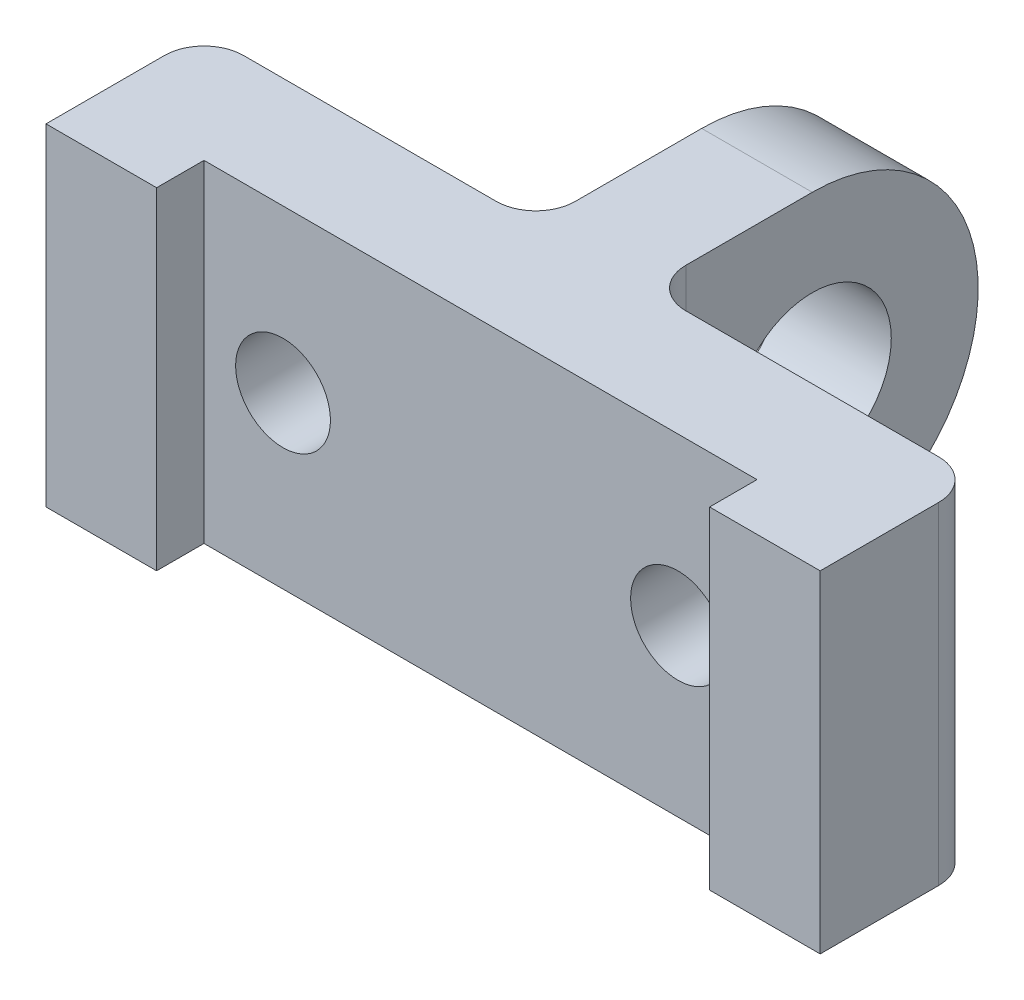
ISO-10303-21;
HEADER;
FILE_DESCRIPTION(('STEP AP214'),'2;1');
FILE_NAME('part.step','',(''),(''),'','','');
FILE_SCHEMA(('AUTOMOTIVE_DESIGN { 1 0 10303 214 1 1 1 1 }'));
ENDSEC;
DATA;
#1=APPLICATION_CONTEXT('core data for automotive mechanical design processes');
#2=APPLICATION_PROTOCOL_DEFINITION('international standard','automotive_design',2000,#1);
#3=PRODUCT_CONTEXT('',#1,'mechanical');
#4=PRODUCT('Part','Part','',(#3));
#5=PRODUCT_RELATED_PRODUCT_CATEGORY('part','',(#4));
#6=PRODUCT_DEFINITION_FORMATION('','',#4);
#7=PRODUCT_DEFINITION_CONTEXT('part definition',#1,'design');
#8=PRODUCT_DEFINITION('design','',#6,#7);
#9=PRODUCT_DEFINITION_SHAPE('','',#8);
#10=(LENGTH_UNIT() NAMED_UNIT(*) SI_UNIT(.MILLI.,.METRE.));
#11=(NAMED_UNIT(*) PLANE_ANGLE_UNIT() SI_UNIT($,.RADIAN.));
#12=(NAMED_UNIT(*) SI_UNIT($,.STERADIAN.) SOLID_ANGLE_UNIT());
#13=UNCERTAINTY_MEASURE_WITH_UNIT(LENGTH_MEASURE(1.E-05),#10,'distance_accuracy_value','');
#14=(GEOMETRIC_REPRESENTATION_CONTEXT(3) GLOBAL_UNCERTAINTY_ASSIGNED_CONTEXT((#13)) GLOBAL_UNIT_ASSIGNED_CONTEXT((#10,
#11,#12)) REPRESENTATION_CONTEXT('',''));
#15=CARTESIAN_POINT('',(0.,0.,0.));
#16=DIRECTION('',(0.,0.,1.));
#17=DIRECTION('',(1.,0.,0.));
#18=AXIS2_PLACEMENT_3D('',#15,#16,#17);
#19=CARTESIAN_POINT('',(7.,0.,-21.));
#20=DIRECTION('',(-1.,0.,0.));
#21=DIRECTION('',(0.,0.,1.));
#22=AXIS2_PLACEMENT_3D('',#19,#20,#21);
#23=CYLINDRICAL_SURFACE('',#22,21.);
#24=DIRECTION('',(-1.,0.,0.));
#25=VECTOR('',#24,1.);
#26=CARTESIAN_POINT('',(-49.,21.,-21.));
#27=LINE('',#26,#25);
#28=CARTESIAN_POINT('',(7.,21.,-21.));
#29=VERTEX_POINT('',#28);
#30=CARTESIAN_POINT('',(-7.,21.,-21.));
#31=VERTEX_POINT('',#30);
#32=EDGE_CURVE('E261',#29,#31,#27,.T.);
#33=ORIENTED_EDGE('',*,*,#32,.F.);
#34=CARTESIAN_POINT('',(7.,0.,-21.));
#35=DIRECTION('',(1.,0.,0.));
#36=DIRECTION('',(0.,0.,-1.));
#37=AXIS2_PLACEMENT_3D('',#34,#35,#36);
#38=CIRCLE('',#37,21.);
#39=CARTESIAN_POINT('',(7.,-21.,-21.));
#40=VERTEX_POINT('',#39);
#41=EDGE_CURVE('E267',#40,#29,#38,.T.);
#42=ORIENTED_EDGE('',*,*,#41,.F.);
#43=DIRECTION('',(-1.,0.,0.));
#44=VECTOR('',#43,1.);
#45=CARTESIAN_POINT('',(-49.,-21.,-21.));
#46=LINE('',#45,#44);
#47=CARTESIAN_POINT('',(-7.,-21.,-21.));
#48=VERTEX_POINT('',#47);
#49=EDGE_CURVE('E264',#48,#40,#46,.F.);
#50=ORIENTED_EDGE('',*,*,#49,.F.);
#51=CARTESIAN_POINT('',(-7.,0.,-21.));
#52=DIRECTION('',(1.,0.,0.));
#53=DIRECTION('',(0.,0.,-1.));
#54=AXIS2_PLACEMENT_3D('',#51,#52,#53);
#55=CIRCLE('',#54,21.);
#56=EDGE_CURVE('E269',#31,#48,#55,.F.);
#57=ORIENTED_EDGE('',*,*,#56,.F.);
#58=EDGE_LOOP('',(#33,#42,#50,#57));
#59=FACE_BOUND('',#58,.T.);
#60=ADVANCED_FACE('F40',(#59),#23,.T.);
#61=CARTESIAN_POINT('',(0.,0.,0.));
#62=DIRECTION('',(0.,0.,-1.));
#63=DIRECTION('',(-1.,0.,0.));
#64=AXIS2_PLACEMENT_3D('',#61,#62,#63);
#65=PLANE('',#64);
#66=CARTESIAN_POINT('',(-25.,0.498932179860301,0.));
#67=DIRECTION('',(0.,0.,1.));
#68=DIRECTION('',(1.,0.,0.));
#69=AXIS2_PLACEMENT_3D('',#66,#67,#68);
#70=CIRCLE('',#69,6.);
#71=CARTESIAN_POINT('',(-19.,0.498932179860301,0.));
#72=VERTEX_POINT('',#71);
#73=EDGE_CURVE('E214',#72,#72,#70,.T.);
#74=ORIENTED_EDGE('',*,*,#73,.T.);
#75=EDGE_LOOP('',(#74));
#76=FACE_BOUND('',#75,.T.);
#77=DIRECTION('',(-1.,0.,0.));
#78=VECTOR('',#77,1.);
#79=CARTESIAN_POINT('',(-49.,21.,0.));
#80=LINE('',#79,#78);
#81=CARTESIAN_POINT('',(-12.,21.,0.));
#82=VERTEX_POINT('',#81);
#83=CARTESIAN_POINT('',(-44.,21.,0.));
#84=VERTEX_POINT('',#83);
#85=EDGE_CURVE('E226',#82,#84,#80,.T.);
#86=ORIENTED_EDGE('',*,*,#85,.F.);
#87=DIRECTION('',(0.,-1.,0.));
#88=VECTOR('',#87,1.);
#89=CARTESIAN_POINT('',(-12.,0.,0.));
#90=LINE('',#89,#88);
#91=CARTESIAN_POINT('',(-12.,-21.,0.));
#92=VERTEX_POINT('',#91);
#93=EDGE_CURVE('E281',#82,#92,#90,.T.);
#94=ORIENTED_EDGE('',*,*,#93,.T.);
#95=DIRECTION('',(1.,0.,0.));
#96=VECTOR('',#95,1.);
#97=CARTESIAN_POINT('',(-49.,-21.,0.));
#98=LINE('',#97,#96);
#99=CARTESIAN_POINT('',(-44.,-21.,0.));
#100=VERTEX_POINT('',#99);
#101=EDGE_CURVE('E230',#100,#92,#98,.T.);
#102=ORIENTED_EDGE('',*,*,#101,.F.);
#103=DIRECTION('',(0.,-1.,0.));
#104=VECTOR('',#103,1.);
#105=CARTESIAN_POINT('',(-44.,21.,0.));
#106=LINE('',#105,#104);
#107=EDGE_CURVE('E248',#100,#84,#106,.F.);
#108=ORIENTED_EDGE('',*,*,#107,.T.);
#109=EDGE_LOOP('',(#86,#94,#102,#108));
#110=FACE_BOUND('',#109,.T.);
#111=ADVANCED_FACE('F337',(#76,#110),#65,.T.);
#112=CARTESIAN_POINT('',(0.,0.,14.));
#113=DIRECTION('',(0.,0.,-1.));
#114=DIRECTION('',(-1.,0.,0.));
#115=AXIS2_PLACEMENT_3D('',#112,#113,#114);
#116=PLANE('',#115);
#117=CARTESIAN_POINT('',(25.,0.,14.));
#118=DIRECTION('',(0.,0.,-1.));
#119=DIRECTION('',(-1.,0.,0.));
#120=AXIS2_PLACEMENT_3D('',#117,#118,#119);
#121=CIRCLE('',#120,5.99999999999999);
#122=CARTESIAN_POINT('',(19.,0.,14.));
#123=VERTEX_POINT('',#122);
#124=EDGE_CURVE('E223',#123,#123,#121,.F.);
#125=ORIENTED_EDGE('',*,*,#124,.F.);
#126=EDGE_LOOP('',(#125));
#127=FACE_BOUND('',#126,.T.);
#128=CARTESIAN_POINT('',(-25.,0.498932179860301,14.));
#129=DIRECTION('',(0.,0.,-1.));
#130=DIRECTION('',(-1.,0.,0.));
#131=AXIS2_PLACEMENT_3D('',#128,#129,#130);
#132=CIRCLE('',#131,6.);
#133=CARTESIAN_POINT('',(-31.,0.498932179860301,14.));
#134=VERTEX_POINT('',#133);
#135=EDGE_CURVE('E217',#134,#134,#132,.F.);
#136=ORIENTED_EDGE('',*,*,#135,.F.);
#137=EDGE_LOOP('',(#136));
#138=FACE_BOUND('',#137,.T.);
#139=DIRECTION('',(0.,-1.,0.));
#140=VECTOR('',#139,1.);
#141=CARTESIAN_POINT('',(35.,-21.,14.));
#142=LINE('',#141,#140);
#143=CARTESIAN_POINT('',(35.,21.,14.));
#144=VERTEX_POINT('',#143);
#145=CARTESIAN_POINT('',(35.,-21.,14.));
#146=VERTEX_POINT('',#145);
#147=EDGE_CURVE('E180',#144,#146,#142,.T.);
#148=ORIENTED_EDGE('',*,*,#147,.F.);
#149=DIRECTION('',(-1.,0.,0.));
#150=VECTOR('',#149,1.);
#151=CARTESIAN_POINT('',(-49.,21.,14.));
#152=LINE('',#151,#150);
#153=CARTESIAN_POINT('',(-35.,21.,14.));
#154=VERTEX_POINT('',#153);
#155=EDGE_CURVE('E227',#144,#154,#152,.T.);
#156=ORIENTED_EDGE('',*,*,#155,.T.);
#157=DIRECTION('',(0.,1.,0.));
#158=VECTOR('',#157,1.);
#159=CARTESIAN_POINT('',(-35.,-21.,14.));
#160=LINE('',#159,#158);
#161=CARTESIAN_POINT('',(-35.,-21.,14.));
#162=VERTEX_POINT('',#161);
#163=EDGE_CURVE('E195',#162,#154,#160,.T.);
#164=ORIENTED_EDGE('',*,*,#163,.F.);
#165=DIRECTION('',(1.,0.,0.));
#166=VECTOR('',#165,1.);
#167=CARTESIAN_POINT('',(-49.,-21.,14.));
#168=LINE('',#167,#166);
#169=EDGE_CURVE('E229',#162,#146,#168,.T.);
#170=ORIENTED_EDGE('',*,*,#169,.T.);
#171=EDGE_LOOP('',(#148,#156,#164,#170));
#172=FACE_BOUND('',#171,.T.);
#173=ADVANCED_FACE('F317',(#127,#138,#172),#116,.F.);
#174=CARTESIAN_POINT('',(12.,-21.,0.));
#175=VERTEX_POINT('',#174);
#176=CARTESIAN_POINT('',(44.,-21.,0.));
#177=VERTEX_POINT('',#176);
#178=EDGE_CURVE('E236',#175,#177,#98,.T.);
#179=ORIENTED_EDGE('',*,*,#178,.F.);
#180=DIRECTION('',(0.,-1.,0.));
#181=VECTOR('',#180,1.);
#182=CARTESIAN_POINT('',(12.,21.,0.));
#183=LINE('',#182,#181);
#184=CARTESIAN_POINT('',(12.,21.,0.));
#185=VERTEX_POINT('',#184);
#186=EDGE_CURVE('E279',#175,#185,#183,.F.);
#187=ORIENTED_EDGE('',*,*,#186,.T.);
#188=CARTESIAN_POINT('',(44.,21.,0.));
#189=VERTEX_POINT('',#188);
#190=EDGE_CURVE('E233',#189,#185,#80,.T.);
#191=ORIENTED_EDGE('',*,*,#190,.F.);
#192=DIRECTION('',(0.,1.,0.));
#193=VECTOR('',#192,1.);
#194=CARTESIAN_POINT('',(44.,-21.,0.));
#195=LINE('',#194,#193);
#196=EDGE_CURVE('E256',#189,#177,#195,.F.);
#197=ORIENTED_EDGE('',*,*,#196,.T.);
#198=EDGE_LOOP('',(#179,#187,#191,#197));
#199=FACE_BOUND('',#198,.T.);
#200=CARTESIAN_POINT('',(25.,0.,0.));
#201=DIRECTION('',(0.,0.,1.));
#202=DIRECTION('',(1.,0.,0.));
#203=AXIS2_PLACEMENT_3D('',#200,#201,#202);
#204=CIRCLE('',#203,5.99999999999999);
#205=CARTESIAN_POINT('',(31.,0.,0.));
#206=VERTEX_POINT('',#205);
#207=EDGE_CURVE('E220',#206,#206,#204,.T.);
#208=ORIENTED_EDGE('',*,*,#207,.T.);
#209=EDGE_LOOP('',(#208));
#210=FACE_BOUND('',#209,.T.);
#211=ADVANCED_FACE('F305',(#199,#210),#65,.T.);
#212=CARTESIAN_POINT('',(49.,-21.,14.));
#213=DIRECTION('',(-1.,0.,0.));
#214=DIRECTION('',(0.,0.,1.));
#215=AXIS2_PLACEMENT_3D('',#212,#213,#214);
#216=PLANE('',#215);
#217=DIRECTION('',(0.,0.,-1.));
#218=VECTOR('',#217,1.);
#219=CARTESIAN_POINT('',(49.,-21.,14.));
#220=LINE('',#219,#218);
#221=CARTESIAN_POINT('',(49.,-21.,20.));
#222=VERTEX_POINT('',#221);
#223=CARTESIAN_POINT('',(49.,-21.,5.));
#224=VERTEX_POINT('',#223);
#225=EDGE_CURVE('E232',#222,#224,#220,.T.);
#226=ORIENTED_EDGE('',*,*,#225,.T.);
#227=DIRECTION('',(0.,1.,0.));
#228=VECTOR('',#227,1.);
#229=CARTESIAN_POINT('',(49.,21.,5.));
#230=LINE('',#229,#228);
#231=CARTESIAN_POINT('',(49.,21.,5.));
#232=VERTEX_POINT('',#231);
#233=EDGE_CURVE('E160',#224,#232,#230,.T.);
#234=ORIENTED_EDGE('',*,*,#233,.T.);
#235=DIRECTION('',(0.,0.,-1.));
#236=VECTOR('',#235,1.);
#237=CARTESIAN_POINT('',(49.,21.,14.));
#238=LINE('',#237,#236);
#239=CARTESIAN_POINT('',(49.,21.,20.));
#240=VERTEX_POINT('',#239);
#241=EDGE_CURVE('E153',#240,#232,#238,.T.);
#242=ORIENTED_EDGE('',*,*,#241,.F.);
#243=DIRECTION('',(0.,1.,0.));
#244=VECTOR('',#243,1.);
#245=CARTESIAN_POINT('',(49.,-21.,20.));
#246=LINE('',#245,#244);
#247=EDGE_CURVE('E158',#222,#240,#246,.T.);
#248=ORIENTED_EDGE('',*,*,#247,.F.);
#249=EDGE_LOOP('',(#226,#234,#242,#248));
#250=FACE_BOUND('',#249,.T.);
#251=ADVANCED_FACE('F156',(#250),#216,.F.);
#252=CARTESIAN_POINT('',(-49.,21.,14.));
#253=DIRECTION('',(0.,-1.,0.));
#254=DIRECTION('',(0.,0.,-1.));
#255=AXIS2_PLACEMENT_3D('',#252,#253,#254);
#256=PLANE('',#255);
#257=DIRECTION('',(0.,0.,1.));
#258=VECTOR('',#257,1.);
#259=CARTESIAN_POINT('',(7.,21.,0.));
#260=LINE('',#259,#258);
#261=CARTESIAN_POINT('',(7.,21.,-5.));
#262=VERTEX_POINT('',#261);
#263=EDGE_CURVE('E183',#29,#262,#260,.T.);
#264=ORIENTED_EDGE('',*,*,#263,.F.);
#265=ORIENTED_EDGE('',*,*,#32,.T.);
#266=DIRECTION('',(0.,0.,1.));
#267=VECTOR('',#266,1.);
#268=CARTESIAN_POINT('',(-7.,21.,0.));
#269=LINE('',#268,#267);
#270=CARTESIAN_POINT('',(-7.,21.,-5.));
#271=VERTEX_POINT('',#270);
#272=EDGE_CURVE('E186',#31,#271,#269,.T.);
#273=ORIENTED_EDGE('',*,*,#272,.T.);
#274=CARTESIAN_POINT('',(-12.,21.,-5.));
#275=DIRECTION('',(0.,-1.,0.));
#276=DIRECTION('',(0.,0.,-1.));
#277=AXIS2_PLACEMENT_3D('',#274,#275,#276);
#278=CIRCLE('',#277,5.);
#279=EDGE_CURVE('E11',#271,#82,#278,.T.);
#280=ORIENTED_EDGE('',*,*,#279,.T.);
#281=ORIENTED_EDGE('',*,*,#85,.T.);
#282=CARTESIAN_POINT('',(-44.,21.,5.));
#283=DIRECTION('',(0.,-1.,0.));
#284=DIRECTION('',(0.,0.,-1.));
#285=AXIS2_PLACEMENT_3D('',#282,#283,#284);
#286=CIRCLE('',#285,5.);
#287=CARTESIAN_POINT('',(-49.,21.,5.));
#288=VERTEX_POINT('',#287);
#289=EDGE_CURVE('E251',#84,#288,#286,.F.);
#290=ORIENTED_EDGE('',*,*,#289,.T.);
#291=DIRECTION('',(0.,0.,-1.));
#292=VECTOR('',#291,1.);
#293=CARTESIAN_POINT('',(-49.,21.,14.));
#294=LINE('',#293,#292);
#295=CARTESIAN_POINT('',(-49.,21.,20.));
#296=VERTEX_POINT('',#295);
#297=EDGE_CURVE('E163',#296,#288,#294,.T.);
#298=ORIENTED_EDGE('',*,*,#297,.F.);
#299=DIRECTION('',(-1.,0.,0.));
#300=VECTOR('',#299,1.);
#301=CARTESIAN_POINT('',(-49.,21.,20.));
#302=LINE('',#301,#300);
#303=CARTESIAN_POINT('',(-35.,21.,20.));
#304=VERTEX_POINT('',#303);
#305=EDGE_CURVE('E203',#304,#296,#302,.T.);
#306=ORIENTED_EDGE('',*,*,#305,.F.);
#307=DIRECTION('',(0.,0.,-1.));
#308=VECTOR('',#307,1.);
#309=CARTESIAN_POINT('',(-35.,21.,20.));
#310=LINE('',#309,#308);
#311=EDGE_CURVE('E206',#304,#154,#310,.T.);
#312=ORIENTED_EDGE('',*,*,#311,.T.);
#313=ORIENTED_EDGE('',*,*,#155,.F.);
#314=DIRECTION('',(0.,0.,-1.));
#315=VECTOR('',#314,1.);
#316=CARTESIAN_POINT('',(35.,21.,20.));
#317=LINE('',#316,#315);
#318=CARTESIAN_POINT('',(35.,21.,20.));
#319=VERTEX_POINT('',#318);
#320=EDGE_CURVE('E171',#319,#144,#317,.T.);
#321=ORIENTED_EDGE('',*,*,#320,.F.);
#322=DIRECTION('',(-1.,0.,0.));
#323=VECTOR('',#322,1.);
#324=CARTESIAN_POINT('',(49.,21.,20.));
#325=LINE('',#324,#323);
#326=EDGE_CURVE('E166',#240,#319,#325,.T.);
#327=ORIENTED_EDGE('',*,*,#326,.F.);
#328=ORIENTED_EDGE('',*,*,#241,.T.);
#329=CARTESIAN_POINT('',(44.,21.,5.));
#330=DIRECTION('',(0.,-1.,0.));
#331=DIRECTION('',(0.,0.,-1.));
#332=AXIS2_PLACEMENT_3D('',#329,#330,#331);
#333=CIRCLE('',#332,5.);
#334=EDGE_CURVE('E254',#232,#189,#333,.F.);
#335=ORIENTED_EDGE('',*,*,#334,.T.);
#336=ORIENTED_EDGE('',*,*,#190,.T.);
#337=CARTESIAN_POINT('',(12.,21.,-5.));
#338=DIRECTION('',(0.,-1.,0.));
#339=DIRECTION('',(0.,0.,-1.));
#340=AXIS2_PLACEMENT_3D('',#337,#338,#339);
#341=CIRCLE('',#340,5.);
#342=EDGE_CURVE('E287',#185,#262,#341,.T.);
#343=ORIENTED_EDGE('',*,*,#342,.T.);
#344=EDGE_LOOP('',(#264,#265,#273,#280,#281,#290,#298,#306,#312,#313,#321,#327,#328,#335,#336,#343));
#345=FACE_BOUND('',#344,.T.);
#346=ADVANCED_FACE('F168',(#345),#256,.F.);
#347=CARTESIAN_POINT('',(-49.,-21.,14.));
#348=DIRECTION('',(1.,0.,0.));
#349=DIRECTION('',(0.,0.,-1.));
#350=AXIS2_PLACEMENT_3D('',#347,#348,#349);
#351=PLANE('',#350);
#352=ORIENTED_EDGE('',*,*,#297,.T.);
#353=DIRECTION('',(0.,-1.,0.));
#354=VECTOR('',#353,1.);
#355=CARTESIAN_POINT('',(-49.,-21.,5.));
#356=LINE('',#355,#354);
#357=CARTESIAN_POINT('',(-49.,-21.,5.));
#358=VERTEX_POINT('',#357);
#359=EDGE_CURVE('E162',#288,#358,#356,.T.);
#360=ORIENTED_EDGE('',*,*,#359,.T.);
#361=DIRECTION('',(0.,0.,-1.));
#362=VECTOR('',#361,1.);
#363=CARTESIAN_POINT('',(-49.,-21.,14.));
#364=LINE('',#363,#362);
#365=CARTESIAN_POINT('',(-49.,-21.,20.));
#366=VERTEX_POINT('',#365);
#367=EDGE_CURVE('E239',#366,#358,#364,.T.);
#368=ORIENTED_EDGE('',*,*,#367,.F.);
#369=DIRECTION('',(0.,-1.,0.));
#370=VECTOR('',#369,1.);
#371=CARTESIAN_POINT('',(-49.,-21.,20.));
#372=LINE('',#371,#370);
#373=EDGE_CURVE('E196',#296,#366,#372,.T.);
#374=ORIENTED_EDGE('',*,*,#373,.F.);
#375=EDGE_LOOP('',(#352,#360,#368,#374));
#376=FACE_BOUND('',#375,.T.);
#377=ADVANCED_FACE('F328',(#376),#351,.F.);
#378=CARTESIAN_POINT('',(-49.,-21.,14.));
#379=DIRECTION('',(0.,1.,0.));
#380=DIRECTION('',(0.,0.,1.));
#381=AXIS2_PLACEMENT_3D('',#378,#379,#380);
#382=PLANE('',#381);
#383=ORIENTED_EDGE('',*,*,#101,.T.);
#384=CARTESIAN_POINT('',(-12.,-21.,-5.));
#385=DIRECTION('',(0.,1.,0.));
#386=DIRECTION('',(0.,0.,1.));
#387=AXIS2_PLACEMENT_3D('',#384,#385,#386);
#388=CIRCLE('',#387,5.);
#389=CARTESIAN_POINT('',(-7.,-21.,-5.));
#390=VERTEX_POINT('',#389);
#391=EDGE_CURVE('E48',#92,#390,#388,.T.);
#392=ORIENTED_EDGE('',*,*,#391,.T.);
#393=DIRECTION('',(0.,0.,-1.));
#394=VECTOR('',#393,1.);
#395=CARTESIAN_POINT('',(-7.,-21.,0.));
#396=LINE('',#395,#394);
#397=EDGE_CURVE('E341',#390,#48,#396,.T.);
#398=ORIENTED_EDGE('',*,*,#397,.T.);
#399=ORIENTED_EDGE('',*,*,#49,.T.);
#400=DIRECTION('',(0.,0.,-1.));
#401=VECTOR('',#400,1.);
#402=CARTESIAN_POINT('',(7.,-21.,0.));
#403=LINE('',#402,#401);
#404=CARTESIAN_POINT('',(7.,-21.,-5.));
#405=VERTEX_POINT('',#404);
#406=EDGE_CURVE('E299',#405,#40,#403,.T.);
#407=ORIENTED_EDGE('',*,*,#406,.F.);
#408=CARTESIAN_POINT('',(12.,-21.,-5.));
#409=DIRECTION('',(0.,1.,0.));
#410=DIRECTION('',(0.,0.,1.));
#411=AXIS2_PLACEMENT_3D('',#408,#409,#410);
#412=CIRCLE('',#411,5.);
#413=EDGE_CURVE('E285',#405,#175,#412,.T.);
#414=ORIENTED_EDGE('',*,*,#413,.T.);
#415=ORIENTED_EDGE('',*,*,#178,.T.);
#416=CARTESIAN_POINT('',(44.,-21.,5.));
#417=DIRECTION('',(0.,1.,0.));
#418=DIRECTION('',(0.,0.,1.));
#419=AXIS2_PLACEMENT_3D('',#416,#417,#418);
#420=CIRCLE('',#419,5.);
#421=EDGE_CURVE('E259',#177,#224,#420,.F.);
#422=ORIENTED_EDGE('',*,*,#421,.T.);
#423=ORIENTED_EDGE('',*,*,#225,.F.);
#424=DIRECTION('',(1.,0.,0.));
#425=VECTOR('',#424,1.);
#426=CARTESIAN_POINT('',(49.,-21.,20.));
#427=LINE('',#426,#425);
#428=CARTESIAN_POINT('',(35.,-21.,20.));
#429=VERTEX_POINT('',#428);
#430=EDGE_CURVE('E179',#429,#222,#427,.T.);
#431=ORIENTED_EDGE('',*,*,#430,.F.);
#432=DIRECTION('',(0.,0.,-1.));
#433=VECTOR('',#432,1.);
#434=CARTESIAN_POINT('',(35.,-21.,20.));
#435=LINE('',#434,#433);
#436=EDGE_CURVE('E190',#429,#146,#435,.T.);
#437=ORIENTED_EDGE('',*,*,#436,.T.);
#438=ORIENTED_EDGE('',*,*,#169,.F.);
#439=DIRECTION('',(0.,0.,-1.));
#440=VECTOR('',#439,1.);
#441=CARTESIAN_POINT('',(-35.,-21.,20.));
#442=LINE('',#441,#440);
#443=CARTESIAN_POINT('',(-35.,-21.,20.));
#444=VERTEX_POINT('',#443);
#445=EDGE_CURVE('E211',#444,#162,#442,.T.);
#446=ORIENTED_EDGE('',*,*,#445,.F.);
#447=DIRECTION('',(1.,0.,0.));
#448=VECTOR('',#447,1.);
#449=CARTESIAN_POINT('',(-49.,-21.,20.));
#450=LINE('',#449,#448);
#451=EDGE_CURVE('E199',#366,#444,#450,.T.);
#452=ORIENTED_EDGE('',*,*,#451,.F.);
#453=ORIENTED_EDGE('',*,*,#367,.T.);
#454=CARTESIAN_POINT('',(-44.,-21.,5.));
#455=DIRECTION('',(0.,1.,0.));
#456=DIRECTION('',(0.,0.,1.));
#457=AXIS2_PLACEMENT_3D('',#454,#455,#456);
#458=CIRCLE('',#457,5.);
#459=EDGE_CURVE('E246',#358,#100,#458,.F.);
#460=ORIENTED_EDGE('',*,*,#459,.T.);
#461=EDGE_LOOP('',(#383,#392,#398,#399,#407,#414,#415,#422,#423,#431,#437,#438,#446,#452,#453,#460));
#462=FACE_BOUND('',#461,.T.);
#463=ADVANCED_FACE('F303',(#462),#382,.F.);
#464=CARTESIAN_POINT('',(25.,0.,31.));
#465=DIRECTION('',(0.,0.,-1.));
#466=DIRECTION('',(-1.,0.,0.));
#467=AXIS2_PLACEMENT_3D('',#464,#465,#466);
#468=CYLINDRICAL_SURFACE('',#467,5.99999999999999);
#469=ORIENTED_EDGE('',*,*,#207,.F.);
#470=EDGE_LOOP('',(#469));
#471=FACE_BOUND('',#470,.T.);
#472=ORIENTED_EDGE('',*,*,#124,.T.);
#473=EDGE_LOOP('',(#472));
#474=FACE_BOUND('',#473,.T.);
#475=ADVANCED_FACE('F407',(#471,#474),#468,.F.);
#476=CARTESIAN_POINT('',(-25.,0.498932179860301,150.));
#477=DIRECTION('',(0.,0.,-1.));
#478=DIRECTION('',(-1.,0.,0.));
#479=AXIS2_PLACEMENT_3D('',#476,#477,#478);
#480=CYLINDRICAL_SURFACE('',#479,6.);
#481=ORIENTED_EDGE('',*,*,#73,.F.);
#482=EDGE_LOOP('',(#481));
#483=FACE_BOUND('',#482,.T.);
#484=ORIENTED_EDGE('',*,*,#135,.T.);
#485=EDGE_LOOP('',(#484));
#486=FACE_BOUND('',#485,.T.);
#487=ADVANCED_FACE('F517',(#483,#486),#480,.F.);
#488=CARTESIAN_POINT('',(-44.,-21.,5.));
#489=DIRECTION('',(0.,1.,0.));
#490=DIRECTION('',(0.,0.,1.));
#491=AXIS2_PLACEMENT_3D('',#488,#489,#490);
#492=CYLINDRICAL_SURFACE('',#491,5.);
#493=ORIENTED_EDGE('',*,*,#289,.F.);
#494=ORIENTED_EDGE('',*,*,#107,.F.);
#495=ORIENTED_EDGE('',*,*,#459,.F.);
#496=ORIENTED_EDGE('',*,*,#359,.F.);
#497=EDGE_LOOP('',(#493,#494,#495,#496));
#498=FACE_BOUND('',#497,.T.);
#499=ADVANCED_FACE('F332',(#498),#492,.T.);
#500=CARTESIAN_POINT('',(-35.,-21.,20.));
#501=DIRECTION('',(-1.,0.,0.));
#502=DIRECTION('',(0.,0.,1.));
#503=AXIS2_PLACEMENT_3D('',#500,#501,#502);
#504=PLANE('',#503);
#505=ORIENTED_EDGE('',*,*,#163,.T.);
#506=ORIENTED_EDGE('',*,*,#311,.F.);
#507=DIRECTION('',(0.,1.,0.));
#508=VECTOR('',#507,1.);
#509=CARTESIAN_POINT('',(-35.,-21.,20.));
#510=LINE('',#509,#508);
#511=EDGE_CURVE('E201',#444,#304,#510,.T.);
#512=ORIENTED_EDGE('',*,*,#511,.F.);
#513=ORIENTED_EDGE('',*,*,#445,.T.);
#514=EDGE_LOOP('',(#505,#506,#512,#513));
#515=FACE_BOUND('',#514,.T.);
#516=ADVANCED_FACE('F322',(#515),#504,.F.);
#517=CARTESIAN_POINT('',(0.,0.,20.));
#518=DIRECTION('',(0.,0.,-1.));
#519=DIRECTION('',(-1.,0.,0.));
#520=AXIS2_PLACEMENT_3D('',#517,#518,#519);
#521=PLANE('',#520);
#522=ORIENTED_EDGE('',*,*,#373,.T.);
#523=ORIENTED_EDGE('',*,*,#451,.T.);
#524=ORIENTED_EDGE('',*,*,#511,.T.);
#525=ORIENTED_EDGE('',*,*,#305,.T.);
#526=EDGE_LOOP('',(#522,#523,#524,#525));
#527=FACE_BOUND('',#526,.T.);
#528=ADVANCED_FACE('F326',(#527),#521,.F.);
#529=CARTESIAN_POINT('',(44.,-21.,5.));
#530=DIRECTION('',(0.,-1.,0.));
#531=DIRECTION('',(0.,0.,-1.));
#532=AXIS2_PLACEMENT_3D('',#529,#530,#531);
#533=CYLINDRICAL_SURFACE('',#532,5.);
#534=ORIENTED_EDGE('',*,*,#421,.F.);
#535=ORIENTED_EDGE('',*,*,#196,.F.);
#536=ORIENTED_EDGE('',*,*,#334,.F.);
#537=ORIENTED_EDGE('',*,*,#233,.F.);
#538=EDGE_LOOP('',(#534,#535,#536,#537));
#539=FACE_BOUND('',#538,.T.);
#540=ADVANCED_FACE('F310',(#539),#533,.T.);
#541=CARTESIAN_POINT('',(35.,-21.,20.));
#542=DIRECTION('',(1.,0.,0.));
#543=DIRECTION('',(0.,0.,-1.));
#544=AXIS2_PLACEMENT_3D('',#541,#542,#543);
#545=PLANE('',#544);
#546=ORIENTED_EDGE('',*,*,#147,.T.);
#547=ORIENTED_EDGE('',*,*,#436,.F.);
#548=DIRECTION('',(0.,-1.,0.));
#549=VECTOR('',#548,1.);
#550=CARTESIAN_POINT('',(35.,-21.,20.));
#551=LINE('',#550,#549);
#552=EDGE_CURVE('E174',#319,#429,#551,.T.);
#553=ORIENTED_EDGE('',*,*,#552,.F.);
#554=ORIENTED_EDGE('',*,*,#320,.T.);
#555=EDGE_LOOP('',(#546,#547,#553,#554));
#556=FACE_BOUND('',#555,.T.);
#557=ADVANCED_FACE('F315',(#556),#545,.F.);
#558=CARTESIAN_POINT('',(0.,0.,20.));
#559=DIRECTION('',(0.,0.,1.));
#560=DIRECTION('',(1.,0.,0.));
#561=AXIS2_PLACEMENT_3D('',#558,#559,#560);
#562=PLANE('',#561);
#563=ORIENTED_EDGE('',*,*,#247,.T.);
#564=ORIENTED_EDGE('',*,*,#326,.T.);
#565=ORIENTED_EDGE('',*,*,#552,.T.);
#566=ORIENTED_EDGE('',*,*,#430,.T.);
#567=EDGE_LOOP('',(#563,#564,#565,#566));
#568=FACE_BOUND('',#567,.T.);
#569=ADVANCED_FACE('F177',(#568),#562,.T.);
#570=CARTESIAN_POINT('',(7.,0.,0.));
#571=DIRECTION('',(1.,0.,0.));
#572=DIRECTION('',(0.,0.,-1.));
#573=AXIS2_PLACEMENT_3D('',#570,#571,#572);
#574=PLANE('',#573);
#575=CARTESIAN_POINT('',(7.,0.,-21.));
#576=DIRECTION('',(1.,0.,0.));
#577=DIRECTION('',(0.,0.,-1.));
#578=AXIS2_PLACEMENT_3D('',#575,#576,#577);
#579=CIRCLE('',#578,10.);
#580=CARTESIAN_POINT('',(7.,0.,-31.));
#581=VERTEX_POINT('',#580);
#582=EDGE_CURVE('E276',#581,#581,#579,.F.);
#583=ORIENTED_EDGE('',*,*,#582,.T.);
#584=EDGE_LOOP('',(#583));
#585=FACE_BOUND('',#584,.T.);
#586=ORIENTED_EDGE('',*,*,#263,.T.);
#587=DIRECTION('',(0.,-1.,0.));
#588=VECTOR('',#587,1.);
#589=CARTESIAN_POINT('',(7.,-21.,-5.));
#590=LINE('',#589,#588);
#591=EDGE_CURVE('E272',#262,#405,#590,.T.);
#592=ORIENTED_EDGE('',*,*,#591,.T.);
#593=ORIENTED_EDGE('',*,*,#406,.T.);
#594=ORIENTED_EDGE('',*,*,#41,.T.);
#595=EDGE_LOOP('',(#586,#592,#593,#594));
#596=FACE_BOUND('',#595,.T.);
#597=ADVANCED_FACE('F295',(#585,#596),#574,.T.);
#598=CARTESIAN_POINT('',(-7.,0.,0.));
#599=DIRECTION('',(1.,0.,0.));
#600=DIRECTION('',(0.,0.,-1.));
#601=AXIS2_PLACEMENT_3D('',#598,#599,#600);
#602=PLANE('',#601);
#603=CARTESIAN_POINT('',(-7.,0.,-21.));
#604=DIRECTION('',(1.,0.,0.));
#605=DIRECTION('',(0.,0.,-1.));
#606=AXIS2_PLACEMENT_3D('',#603,#604,#605);
#607=CIRCLE('',#606,10.);
#608=CARTESIAN_POINT('',(-7.,0.,-31.));
#609=VERTEX_POINT('',#608);
#610=EDGE_CURVE('E273',#609,#609,#607,.F.);
#611=ORIENTED_EDGE('',*,*,#610,.F.);
#612=EDGE_LOOP('',(#611));
#613=FACE_BOUND('',#612,.T.);
#614=ORIENTED_EDGE('',*,*,#397,.F.);
#615=DIRECTION('',(0.,-1.,0.));
#616=VECTOR('',#615,1.);
#617=CARTESIAN_POINT('',(-7.,0.,-5.));
#618=LINE('',#617,#616);
#619=EDGE_CURVE('E61',#390,#271,#618,.F.);
#620=ORIENTED_EDGE('',*,*,#619,.T.);
#621=ORIENTED_EDGE('',*,*,#272,.F.);
#622=ORIENTED_EDGE('',*,*,#56,.T.);
#623=EDGE_LOOP('',(#614,#620,#621,#622));
#624=FACE_BOUND('',#623,.T.);
#625=ADVANCED_FACE('F351',(#613,#624),#602,.F.);
#626=CARTESIAN_POINT('',(20.5,0.,-21.));
#627=DIRECTION('',(-1.,0.,0.));
#628=DIRECTION('',(0.,0.,1.));
#629=AXIS2_PLACEMENT_3D('',#626,#627,#628);
#630=CYLINDRICAL_SURFACE('',#629,10.);
#631=ORIENTED_EDGE('',*,*,#582,.F.);
#632=EDGE_LOOP('',(#631));
#633=FACE_BOUND('',#632,.T.);
#634=ORIENTED_EDGE('',*,*,#610,.T.);
#635=EDGE_LOOP('',(#634));
#636=FACE_BOUND('',#635,.T.);
#637=ADVANCED_FACE('F348',(#633,#636),#630,.F.);
#638=CARTESIAN_POINT('',(12.,0.,-5.));
#639=DIRECTION('',(0.,1.,0.));
#640=DIRECTION('',(0.,0.,1.));
#641=AXIS2_PLACEMENT_3D('',#638,#639,#640);
#642=CYLINDRICAL_SURFACE('',#641,5.);
#643=ORIENTED_EDGE('',*,*,#342,.F.);
#644=ORIENTED_EDGE('',*,*,#186,.F.);
#645=ORIENTED_EDGE('',*,*,#413,.F.);
#646=ORIENTED_EDGE('',*,*,#591,.F.);
#647=EDGE_LOOP('',(#643,#644,#645,#646));
#648=FACE_BOUND('',#647,.T.);
#649=ADVANCED_FACE('F301',(#648),#642,.F.);
#650=CARTESIAN_POINT('',(-12.,0.,-5.));
#651=DIRECTION('',(0.,-1.,0.));
#652=DIRECTION('',(0.,0.,-1.));
#653=AXIS2_PLACEMENT_3D('',#650,#651,#652);
#654=CYLINDRICAL_SURFACE('',#653,5.);
#655=ORIENTED_EDGE('',*,*,#279,.F.);
#656=ORIENTED_EDGE('',*,*,#619,.F.);
#657=ORIENTED_EDGE('',*,*,#391,.F.);
#658=ORIENTED_EDGE('',*,*,#93,.F.);
#659=EDGE_LOOP('',(#655,#656,#657,#658));
#660=FACE_BOUND('',#659,.T.);
#661=ADVANCED_FACE('F42',(#660),#654,.F.);
#662=CLOSED_SHELL('',(#60,#111,#173,#211,#251,#346,#377,#463,#475,#487,#499,#516,#528,#540,#557,
#569,#597,#625,#637,#649,#661));
#663=MANIFOLD_SOLID_BREP('B2',#662);
#664=ADVANCED_BREP_SHAPE_REPRESENTATION('',(#18,#663),#14);
#665=SHAPE_DEFINITION_REPRESENTATION(#9,#664);
ENDSEC;
END-ISO-10303-21;
